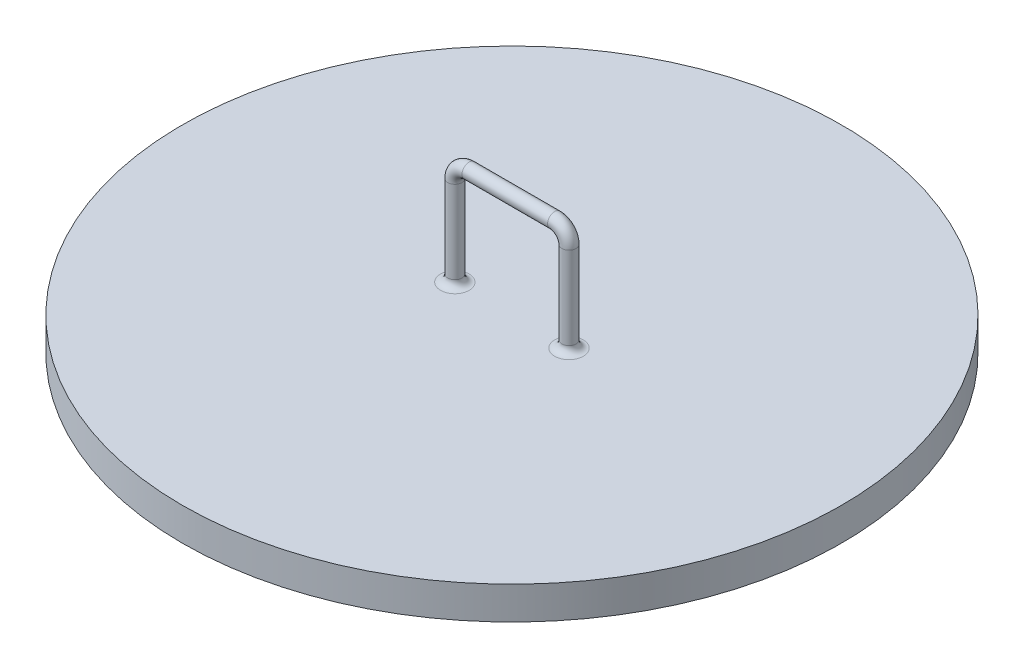
ISO-10303-21;
HEADER;
FILE_DESCRIPTION(('STEP AP214'),'2;1');
FILE_NAME('part.step','',(''),(''),'','','');
FILE_SCHEMA(('AUTOMOTIVE_DESIGN { 1 0 10303 214 1 1 1 1 }'));
ENDSEC;
DATA;
#1=APPLICATION_CONTEXT('core data for automotive mechanical design processes');
#2=APPLICATION_PROTOCOL_DEFINITION('international standard','automotive_design',2000,#1);
#3=PRODUCT_CONTEXT('',#1,'mechanical');
#4=PRODUCT('Part','Part','',(#3));
#5=PRODUCT_RELATED_PRODUCT_CATEGORY('part','',(#4));
#6=PRODUCT_DEFINITION_FORMATION('','',#4);
#7=PRODUCT_DEFINITION_CONTEXT('part definition',#1,'design');
#8=PRODUCT_DEFINITION('design','',#6,#7);
#9=PRODUCT_DEFINITION_SHAPE('','',#8);
#10=(LENGTH_UNIT() NAMED_UNIT(*) SI_UNIT(.MILLI.,.METRE.));
#11=(NAMED_UNIT(*) PLANE_ANGLE_UNIT() SI_UNIT($,.RADIAN.));
#12=(NAMED_UNIT(*) SI_UNIT($,.STERADIAN.) SOLID_ANGLE_UNIT());
#13=UNCERTAINTY_MEASURE_WITH_UNIT(LENGTH_MEASURE(1.E-05),#10,'distance_accuracy_value','');
#14=(GEOMETRIC_REPRESENTATION_CONTEXT(3) GLOBAL_UNCERTAINTY_ASSIGNED_CONTEXT((#13)) GLOBAL_UNIT_ASSIGNED_CONTEXT((#10,
#11,#12)) REPRESENTATION_CONTEXT('',''));
#15=CARTESIAN_POINT('',(0.,0.,0.));
#16=DIRECTION('',(0.,0.,1.));
#17=DIRECTION('',(1.,0.,0.));
#18=AXIS2_PLACEMENT_3D('',#15,#16,#17);
#19=CARTESIAN_POINT('',(0.,0.,0.));
#20=DIRECTION('',(0.,1.,0.));
#21=DIRECTION('',(0.,0.,1.));
#22=AXIS2_PLACEMENT_3D('',#19,#20,#21);
#23=PLANE('',#22);
#24=CARTESIAN_POINT('',(0.,0.,0.));
#25=DIRECTION('',(0.,1.,0.));
#26=DIRECTION('',(0.,0.,1.));
#27=AXIS2_PLACEMENT_3D('',#24,#25,#26);
#28=CIRCLE('',#27,231.);
#29=CARTESIAN_POINT('',(0.,0.,231.));
#30=VERTEX_POINT('',#29);
#31=EDGE_CURVE('E69',#30,#30,#28,.T.);
#32=ORIENTED_EDGE('',*,*,#31,.F.);
#33=EDGE_LOOP('',(#32));
#34=FACE_BOUND('',#33,.T.);
#35=CARTESIAN_POINT('',(0.,0.,0.));
#36=DIRECTION('',(0.,1.,0.));
#37=DIRECTION('',(0.,0.,1.));
#38=AXIS2_PLACEMENT_3D('',#35,#36,#37);
#39=CIRCLE('',#38,228.);
#40=CARTESIAN_POINT('',(0.,0.,228.));
#41=VERTEX_POINT('',#40);
#42=EDGE_CURVE('E73',#41,#41,#39,.T.);
#43=ORIENTED_EDGE('',*,*,#42,.T.);
#44=EDGE_LOOP('',(#43));
#45=FACE_BOUND('',#44,.T.);
#46=ADVANCED_FACE('F43',(#34,#45),#23,.F.);
#47=CARTESIAN_POINT('',(0.,20.,0.));
#48=DIRECTION('',(0.,-1.,0.));
#49=DIRECTION('',(0.,0.,-1.));
#50=AXIS2_PLACEMENT_3D('',#47,#48,#49);
#51=CYLINDRICAL_SURFACE('',#50,231.);
#52=ORIENTED_EDGE('',*,*,#31,.T.);
#53=EDGE_LOOP('',(#52));
#54=FACE_BOUND('',#53,.T.);
#55=CARTESIAN_POINT('',(0.,23.,0.));
#56=DIRECTION('',(0.,1.,0.));
#57=DIRECTION('',(0.,0.,1.));
#58=AXIS2_PLACEMENT_3D('',#55,#56,#57);
#59=CIRCLE('',#58,231.);
#60=CARTESIAN_POINT('',(0.,23.,231.));
#61=VERTEX_POINT('',#60);
#62=EDGE_CURVE('E81',#61,#61,#59,.T.);
#63=ORIENTED_EDGE('',*,*,#62,.F.);
#64=EDGE_LOOP('',(#63));
#65=FACE_BOUND('',#64,.T.);
#66=ADVANCED_FACE('F120',(#54,#65),#51,.T.);
#67=CARTESIAN_POINT('',(0.,20.,0.));
#68=DIRECTION('',(0.,-1.,0.));
#69=DIRECTION('',(0.,0.,-1.));
#70=AXIS2_PLACEMENT_3D('',#67,#68,#69);
#71=CYLINDRICAL_SURFACE('',#70,228.);
#72=CARTESIAN_POINT('',(0.,20.,0.));
#73=DIRECTION('',(0.,1.,0.));
#74=DIRECTION('',(0.,0.,1.));
#75=AXIS2_PLACEMENT_3D('',#72,#73,#74);
#76=CIRCLE('',#75,228.);
#77=CARTESIAN_POINT('',(0.,20.,228.));
#78=VERTEX_POINT('',#77);
#79=EDGE_CURVE('E77',#78,#78,#76,.T.);
#80=ORIENTED_EDGE('',*,*,#79,.T.);
#81=EDGE_LOOP('',(#80));
#82=FACE_BOUND('',#81,.T.);
#83=ORIENTED_EDGE('',*,*,#42,.F.);
#84=EDGE_LOOP('',(#83));
#85=FACE_BOUND('',#84,.T.);
#86=ADVANCED_FACE('F126',(#82,#85),#71,.F.);
#87=CARTESIAN_POINT('',(0.,20.,0.));
#88=DIRECTION('',(0.,1.,0.));
#89=DIRECTION('',(0.,0.,1.));
#90=AXIS2_PLACEMENT_3D('',#87,#88,#89);
#91=PLANE('',#90);
#92=ORIENTED_EDGE('',*,*,#79,.F.);
#93=EDGE_LOOP('',(#92));
#94=FACE_BOUND('',#93,.T.);
#95=ADVANCED_FACE('F117',(#94),#91,.F.);
#96=CARTESIAN_POINT('',(0.,23.,0.));
#97=DIRECTION('',(0.,1.,0.));
#98=DIRECTION('',(0.,0.,1.));
#99=AXIS2_PLACEMENT_3D('',#96,#97,#98);
#100=PLANE('',#99);
#101=CARTESIAN_POINT('',(40.,23.,0.));
#102=DIRECTION('',(0.,1.,0.));
#103=DIRECTION('',(0.,0.,1.));
#104=AXIS2_PLACEMENT_3D('',#101,#102,#103);
#105=CIRCLE('',#104,10.);
#106=CARTESIAN_POINT('',(40.,23.,9.99999999999999));
#107=VERTEX_POINT('',#106);
#108=EDGE_CURVE('E51',#107,#107,#105,.F.);
#109=ORIENTED_EDGE('',*,*,#108,.T.);
#110=EDGE_LOOP('',(#109));
#111=FACE_BOUND('',#110,.T.);
#112=CARTESIAN_POINT('',(-40.,23.,0.));
#113=DIRECTION('',(0.,1.,0.));
#114=DIRECTION('',(0.,0.,1.));
#115=AXIS2_PLACEMENT_3D('',#112,#113,#114);
#116=CIRCLE('',#115,10.);
#117=CARTESIAN_POINT('',(-40.,23.,10.));
#118=VERTEX_POINT('',#117);
#119=EDGE_CURVE('E57',#118,#118,#116,.F.);
#120=ORIENTED_EDGE('',*,*,#119,.T.);
#121=EDGE_LOOP('',(#120));
#122=FACE_BOUND('',#121,.T.);
#123=ORIENTED_EDGE('',*,*,#62,.T.);
#124=EDGE_LOOP('',(#123));
#125=FACE_BOUND('',#124,.T.);
#126=ADVANCED_FACE('F108',(#111,#122,#125),#100,.T.);
#127=CARTESIAN_POINT('',(-40.,78.,0.));
#128=DIRECTION('',(0.,-1.,0.));
#129=DIRECTION('',(0.,0.,-1.));
#130=AXIS2_PLACEMENT_3D('',#127,#128,#129);
#131=CYLINDRICAL_SURFACE('',#130,5.);
#132=CARTESIAN_POINT('',(-40.,28.,0.));
#133=DIRECTION('',(0.,1.,0.));
#134=DIRECTION('',(0.,0.,1.));
#135=AXIS2_PLACEMENT_3D('',#132,#133,#134);
#136=CIRCLE('',#135,5.);
#137=CARTESIAN_POINT('',(-40.,28.,5.));
#138=VERTEX_POINT('',#137);
#139=EDGE_CURVE('E11',#138,#138,#136,.T.);
#140=ORIENTED_EDGE('',*,*,#139,.T.);
#141=EDGE_LOOP('',(#140));
#142=FACE_BOUND('',#141,.T.);
#143=CARTESIAN_POINT('',(-40.,85.9095639938169,0.));
#144=DIRECTION('',(0.,1.,0.));
#145=DIRECTION('',(0.,0.,1.));
#146=AXIS2_PLACEMENT_3D('',#143,#144,#145);
#147=CIRCLE('',#146,5.);
#148=CARTESIAN_POINT('',(-44.9999999999995,85.9095639938169,0.));
#149=VERTEX_POINT('',#148);
#150=EDGE_CURVE('E97',#149,#149,#147,.T.);
#151=ORIENTED_EDGE('',*,*,#150,.F.);
#152=EDGE_LOOP('',(#151));
#153=FACE_BOUND('',#152,.T.);
#154=ADVANCED_FACE('F105',(#142,#153),#131,.T.);
#155=CARTESIAN_POINT('',(40.,78.,0.));
#156=DIRECTION('',(0.,-1.,0.));
#157=DIRECTION('',(0.,0.,-1.));
#158=AXIS2_PLACEMENT_3D('',#155,#156,#157);
#159=CYLINDRICAL_SURFACE('',#158,5.);
#160=CARTESIAN_POINT('',(40.,28.,0.));
#161=DIRECTION('',(0.,1.,0.));
#162=DIRECTION('',(0.,0.,1.));
#163=AXIS2_PLACEMENT_3D('',#160,#161,#162);
#164=CIRCLE('',#163,5.);
#165=CARTESIAN_POINT('',(40.,28.,4.99999999999999));
#166=VERTEX_POINT('',#165);
#167=EDGE_CURVE('E63',#166,#166,#164,.T.);
#168=ORIENTED_EDGE('',*,*,#167,.T.);
#169=EDGE_LOOP('',(#168));
#170=FACE_BOUND('',#169,.T.);
#171=CARTESIAN_POINT('',(40.,85.909563993817,0.));
#172=DIRECTION('',(0.,-1.,0.));
#173=DIRECTION('',(0.,0.,1.));
#174=AXIS2_PLACEMENT_3D('',#171,#172,#173);
#175=CIRCLE('',#174,5.);
#176=CARTESIAN_POINT('',(45.,85.9095639938169,0.));
#177=VERTEX_POINT('',#176);
#178=EDGE_CURVE('E85',#177,#177,#175,.T.);
#179=ORIENTED_EDGE('',*,*,#178,.T.);
#180=EDGE_LOOP('',(#179));
#181=FACE_BOUND('',#180,.T.);
#182=ADVANCED_FACE('F107',(#170,#181),#159,.T.);
#183=CARTESIAN_POINT('',(-30.,85.909563993817,0.));
#184=DIRECTION('',(0.,0.,-1.));
#185=DIRECTION('',(-1.,0.,0.));
#186=AXIS2_PLACEMENT_3D('',#183,#184,#185);
#187=TOROIDAL_SURFACE('',#186,9.99999999999946,5.);
#188=CARTESIAN_POINT('',(-29.9999999999999,95.909563993817,0.));
#189=DIRECTION('',(1.,0.,0.));
#190=DIRECTION('',(0.,0.,1.));
#191=AXIS2_PLACEMENT_3D('',#188,#189,#190);
#192=CIRCLE('',#191,5.);
#193=CARTESIAN_POINT('',(-29.9999999999999,100.909563993816,0.));
#194=VERTEX_POINT('',#193);
#195=EDGE_CURVE('E93',#194,#194,#192,.T.);
#196=CARTESIAN_POINT('',(-30.,85.909563993817,0.));
#197=DIRECTION('',(0.,0.,-1.));
#198=DIRECTION('',(-1.,0.,0.));
#199=AXIS2_PLACEMENT_3D('',#196,#197,#198);
#200=CIRCLE('',#199,14.9999999999995);
#201=EDGE_CURVE('',#149,#194,#200,.T.);
#202=ORIENTED_EDGE('',*,*,#150,.T.);
#203=ORIENTED_EDGE('',*,*,#195,.F.);
#204=ORIENTED_EDGE('',*,*,#201,.T.);
#205=ORIENTED_EDGE('',*,*,#201,.F.);
#206=EDGE_LOOP('',(#202,#204,#203,#205));
#207=FACE_BOUND('',#206,.T.);
#208=ADVANCED_FACE('F103',(#207),#187,.T.);
#209=CARTESIAN_POINT('',(-29.9999999999999,95.909563993817,0.));
#210=DIRECTION('',(1.,0.,0.));
#211=DIRECTION('',(0.,0.,-1.));
#212=AXIS2_PLACEMENT_3D('',#209,#210,#211);
#213=CYLINDRICAL_SURFACE('',#212,5.);
#214=CARTESIAN_POINT('',(29.9999999999999,95.909563993817,0.));
#215=DIRECTION('',(1.,0.,0.));
#216=DIRECTION('',(0.,0.,1.));
#217=AXIS2_PLACEMENT_3D('',#214,#215,#216);
#218=CIRCLE('',#217,5.);
#219=CARTESIAN_POINT('',(29.9999999999999,100.909563993817,0.));
#220=VERTEX_POINT('',#219);
#221=EDGE_CURVE('E89',#220,#220,#218,.T.);
#222=ORIENTED_EDGE('',*,*,#221,.F.);
#223=EDGE_LOOP('',(#222));
#224=FACE_BOUND('',#223,.T.);
#225=ORIENTED_EDGE('',*,*,#195,.T.);
#226=EDGE_LOOP('',(#225));
#227=FACE_BOUND('',#226,.T.);
#228=ADVANCED_FACE('F141',(#224,#227),#213,.T.);
#229=CARTESIAN_POINT('',(30.,85.909563993817,0.));
#230=DIRECTION('',(0.,0.,-1.));
#231=DIRECTION('',(-1.,0.,0.));
#232=AXIS2_PLACEMENT_3D('',#229,#230,#231);
#233=TOROIDAL_SURFACE('',#232,9.99999999999999,5.);
#234=CARTESIAN_POINT('',(30.,85.909563993817,0.));
#235=DIRECTION('',(0.,0.,-1.));
#236=DIRECTION('',(-1.,0.,0.));
#237=AXIS2_PLACEMENT_3D('',#234,#235,#236);
#238=CIRCLE('',#237,15.);
#239=EDGE_CURVE('',#220,#177,#238,.T.);
#240=ORIENTED_EDGE('',*,*,#221,.T.);
#241=ORIENTED_EDGE('',*,*,#178,.F.);
#242=ORIENTED_EDGE('',*,*,#239,.T.);
#243=ORIENTED_EDGE('',*,*,#239,.F.);
#244=EDGE_LOOP('',(#240,#242,#241,#243));
#245=FACE_BOUND('',#244,.T.);
#246=ADVANCED_FACE('F116',(#245),#233,.T.);
#247=CARTESIAN_POINT('',(40.,28.,0.));
#248=DIRECTION('',(0.,1.,0.));
#249=DIRECTION('',(0.,0.,1.));
#250=AXIS2_PLACEMENT_3D('',#247,#248,#249);
#251=TOROIDAL_SURFACE('',#250,10.,5.);
#252=ORIENTED_EDGE('',*,*,#108,.F.);
#253=EDGE_LOOP('',(#252));
#254=FACE_BOUND('',#253,.T.);
#255=ORIENTED_EDGE('',*,*,#167,.F.);
#256=EDGE_LOOP('',(#255));
#257=FACE_BOUND('',#256,.T.);
#258=ADVANCED_FACE('F133',(#254,#257),#251,.F.);
#259=CARTESIAN_POINT('',(-40.,28.,0.));
#260=DIRECTION('',(0.,1.,0.));
#261=DIRECTION('',(0.,0.,1.));
#262=AXIS2_PLACEMENT_3D('',#259,#260,#261);
#263=TOROIDAL_SURFACE('',#262,10.,5.);
#264=ORIENTED_EDGE('',*,*,#119,.F.);
#265=EDGE_LOOP('',(#264));
#266=FACE_BOUND('',#265,.T.);
#267=ORIENTED_EDGE('',*,*,#139,.F.);
#268=EDGE_LOOP('',(#267));
#269=FACE_BOUND('',#268,.T.);
#270=ADVANCED_FACE('F45',(#266,#269),#263,.F.);
#271=CLOSED_SHELL('',(#46,#66,#86,#95,#126,#154,#182,#208,#228,#246,#258,#270));
#272=MANIFOLD_SOLID_BREP('B2',#271);
#273=ADVANCED_BREP_SHAPE_REPRESENTATION('',(#18,#272),#14);
#274=SHAPE_DEFINITION_REPRESENTATION(#9,#273);
ENDSEC;
END-ISO-10303-21;
